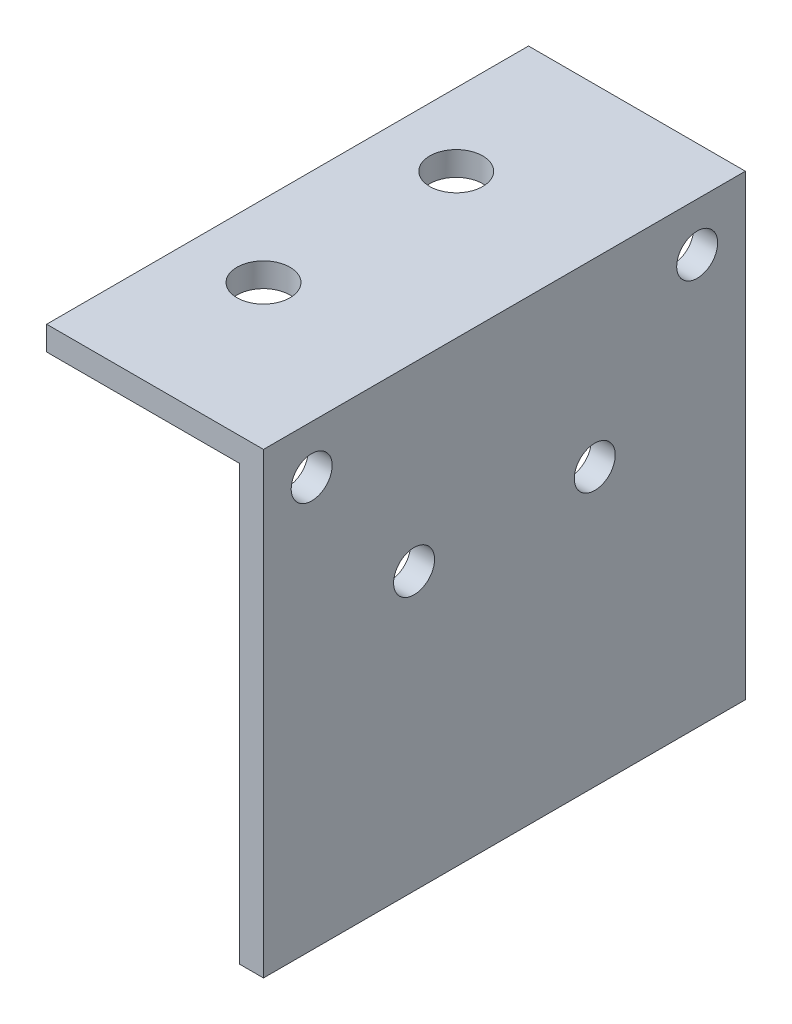
ISO-10303-21;
HEADER;
FILE_DESCRIPTION(('STEP AP214'),'2;1');
FILE_NAME('part.step','',(''),(''),'','','');
FILE_SCHEMA(('AUTOMOTIVE_DESIGN { 1 0 10303 214 1 1 1 1 }'));
ENDSEC;
DATA;
#1=APPLICATION_CONTEXT('core data for automotive mechanical design processes');
#2=APPLICATION_PROTOCOL_DEFINITION('international standard','automotive_design',2000,#1);
#3=PRODUCT_CONTEXT('',#1,'mechanical');
#4=PRODUCT('Part','Part','',(#3));
#5=PRODUCT_RELATED_PRODUCT_CATEGORY('part','',(#4));
#6=PRODUCT_DEFINITION_FORMATION('','',#4);
#7=PRODUCT_DEFINITION_CONTEXT('part definition',#1,'design');
#8=PRODUCT_DEFINITION('design','',#6,#7);
#9=PRODUCT_DEFINITION_SHAPE('','',#8);
#10=(LENGTH_UNIT() NAMED_UNIT(*) SI_UNIT(.MILLI.,.METRE.));
#11=(NAMED_UNIT(*) PLANE_ANGLE_UNIT() SI_UNIT($,.RADIAN.));
#12=(NAMED_UNIT(*) SI_UNIT($,.STERADIAN.) SOLID_ANGLE_UNIT());
#13=UNCERTAINTY_MEASURE_WITH_UNIT(LENGTH_MEASURE(1.E-05),#10,'distance_accuracy_value','');
#14=(GEOMETRIC_REPRESENTATION_CONTEXT(3) GLOBAL_UNCERTAINTY_ASSIGNED_CONTEXT((#13)) GLOBAL_UNIT_ASSIGNED_CONTEXT((#10,
#11,#12)) REPRESENTATION_CONTEXT('',''));
#15=CARTESIAN_POINT('',(0.,0.,0.));
#16=DIRECTION('',(0.,0.,1.));
#17=DIRECTION('',(1.,0.,0.));
#18=AXIS2_PLACEMENT_3D('',#15,#16,#17);
#19=CARTESIAN_POINT('',(0.,-2.,40.));
#20=DIRECTION('',(1.,0.,0.));
#21=DIRECTION('',(0.,0.,-1.));
#22=AXIS2_PLACEMENT_3D('',#19,#20,#21);
#23=PLANE('',#22);
#24=DIRECTION('',(0.,-1.,0.));
#25=VECTOR('',#24,1.);
#26=CARTESIAN_POINT('',(0.,-2.,0.));
#27=LINE('',#26,#25);
#28=CARTESIAN_POINT('',(0.,0.,0.));
#29=VERTEX_POINT('',#28);
#30=CARTESIAN_POINT('',(0.,-2.,0.));
#31=VERTEX_POINT('',#30);
#32=EDGE_CURVE('E119',#29,#31,#27,.T.);
#33=ORIENTED_EDGE('',*,*,#32,.T.);
#34=DIRECTION('',(0.,0.,-1.));
#35=VECTOR('',#34,1.);
#36=CARTESIAN_POINT('',(0.,-2.,40.));
#37=LINE('',#36,#35);
#38=CARTESIAN_POINT('',(0.,-2.,40.));
#39=VERTEX_POINT('',#38);
#40=EDGE_CURVE('E11',#39,#31,#37,.T.);
#41=ORIENTED_EDGE('',*,*,#40,.F.);
#42=DIRECTION('',(0.,-1.,0.));
#43=VECTOR('',#42,1.);
#44=CARTESIAN_POINT('',(0.,-2.,40.));
#45=LINE('',#44,#43);
#46=CARTESIAN_POINT('',(0.,0.,40.));
#47=VERTEX_POINT('',#46);
#48=EDGE_CURVE('E130',#47,#39,#45,.T.);
#49=ORIENTED_EDGE('',*,*,#48,.F.);
#50=DIRECTION('',(0.,0.,-1.));
#51=VECTOR('',#50,1.);
#52=CARTESIAN_POINT('',(0.,0.,40.));
#53=LINE('',#52,#51);
#54=EDGE_CURVE('E115',#47,#29,#53,.T.);
#55=ORIENTED_EDGE('',*,*,#54,.T.);
#56=EDGE_LOOP('',(#33,#41,#49,#55));
#57=FACE_BOUND('',#56,.T.);
#58=ADVANCED_FACE('F35',(#57),#23,.F.);
#59=CARTESIAN_POINT('',(16.,-2.,40.));
#60=DIRECTION('',(0.,1.,0.));
#61=DIRECTION('',(-1.,0.,0.));
#62=AXIS2_PLACEMENT_3D('',#59,#60,#61);
#63=PLANE('',#62);
#64=CARTESIAN_POINT('',(6.,-1.99999999999999,12.));
#65=DIRECTION('',(0.,1.,0.));
#66=DIRECTION('',(-1.,0.,0.));
#67=AXIS2_PLACEMENT_3D('',#64,#65,#66);
#68=CIRCLE('',#67,2.2);
#69=CARTESIAN_POINT('',(3.8,-2.,12.));
#70=VERTEX_POINT('',#69);
#71=EDGE_CURVE('E284',#70,#70,#68,.F.);
#72=ORIENTED_EDGE('',*,*,#71,.F.);
#73=EDGE_LOOP('',(#72));
#74=FACE_BOUND('',#73,.T.);
#75=CARTESIAN_POINT('',(6.,-1.99999999999999,28.));
#76=DIRECTION('',(0.,1.,0.));
#77=DIRECTION('',(-1.,0.,0.));
#78=AXIS2_PLACEMENT_3D('',#75,#76,#77);
#79=CIRCLE('',#78,2.2);
#80=CARTESIAN_POINT('',(3.8,-2.,28.));
#81=VERTEX_POINT('',#80);
#82=EDGE_CURVE('E123',#81,#81,#79,.F.);
#83=ORIENTED_EDGE('',*,*,#82,.F.);
#84=EDGE_LOOP('',(#83));
#85=FACE_BOUND('',#84,.T.);
#86=DIRECTION('',(1.,0.,0.));
#87=VECTOR('',#86,1.);
#88=CARTESIAN_POINT('',(16.,-2.,0.));
#89=LINE('',#88,#87);
#90=CARTESIAN_POINT('',(16.,-2.,0.));
#91=VERTEX_POINT('',#90);
#92=EDGE_CURVE('E122',#31,#91,#89,.T.);
#93=ORIENTED_EDGE('',*,*,#92,.T.);
#94=DIRECTION('',(0.,0.,-1.));
#95=VECTOR('',#94,1.);
#96=CARTESIAN_POINT('',(16.,-2.,40.));
#97=LINE('',#96,#95);
#98=CARTESIAN_POINT('',(16.,-2.,40.));
#99=VERTEX_POINT('',#98);
#100=EDGE_CURVE('E43',#99,#91,#97,.T.);
#101=ORIENTED_EDGE('',*,*,#100,.F.);
#102=DIRECTION('',(1.,0.,0.));
#103=VECTOR('',#102,1.);
#104=CARTESIAN_POINT('',(16.,-2.,40.));
#105=LINE('',#104,#103);
#106=EDGE_CURVE('E88',#39,#99,#105,.T.);
#107=ORIENTED_EDGE('',*,*,#106,.F.);
#108=ORIENTED_EDGE('',*,*,#40,.T.);
#109=EDGE_LOOP('',(#93,#101,#107,#108));
#110=FACE_BOUND('',#109,.T.);
#111=ADVANCED_FACE('F158',(#74,#85,#110),#63,.F.);
#112=CARTESIAN_POINT('',(16.,-38.,40.));
#113=DIRECTION('',(1.,0.,0.));
#114=DIRECTION('',(0.,0.,-1.));
#115=AXIS2_PLACEMENT_3D('',#112,#113,#114);
#116=PLANE('',#115);
#117=CARTESIAN_POINT('',(16.,-4.,4.));
#118=DIRECTION('',(1.,0.,0.));
#119=DIRECTION('',(0.,0.,-1.));
#120=AXIS2_PLACEMENT_3D('',#117,#118,#119);
#121=CIRCLE('',#120,1.7);
#122=CARTESIAN_POINT('',(16.,-4.,2.3));
#123=VERTEX_POINT('',#122);
#124=EDGE_CURVE('E312',#123,#123,#121,.F.);
#125=ORIENTED_EDGE('',*,*,#124,.F.);
#126=EDGE_LOOP('',(#125));
#127=FACE_BOUND('',#126,.T.);
#128=CARTESIAN_POINT('',(16.,-4.,36.));
#129=DIRECTION('',(1.,0.,0.));
#130=DIRECTION('',(0.,0.,-1.));
#131=AXIS2_PLACEMENT_3D('',#128,#129,#130);
#132=CIRCLE('',#131,1.7);
#133=CARTESIAN_POINT('',(16.,-4.,34.3));
#134=VERTEX_POINT('',#133);
#135=EDGE_CURVE('E306',#134,#134,#132,.F.);
#136=ORIENTED_EDGE('',*,*,#135,.F.);
#137=EDGE_LOOP('',(#136));
#138=FACE_BOUND('',#137,.T.);
#139=CARTESIAN_POINT('',(16.,-15.,12.5));
#140=DIRECTION('',(1.,0.,0.));
#141=DIRECTION('',(0.,0.,-1.));
#142=AXIS2_PLACEMENT_3D('',#139,#140,#141);
#143=CIRCLE('',#142,1.7);
#144=CARTESIAN_POINT('',(16.,-15.,10.8));
#145=VERTEX_POINT('',#144);
#146=EDGE_CURVE('E300',#145,#145,#143,.F.);
#147=ORIENTED_EDGE('',*,*,#146,.F.);
#148=EDGE_LOOP('',(#147));
#149=FACE_BOUND('',#148,.T.);
#150=CARTESIAN_POINT('',(16.,-15.,27.5));
#151=DIRECTION('',(1.,0.,0.));
#152=DIRECTION('',(0.,0.,-1.));
#153=AXIS2_PLACEMENT_3D('',#150,#151,#152);
#154=CIRCLE('',#153,1.7);
#155=CARTESIAN_POINT('',(16.,-15.,25.8));
#156=VERTEX_POINT('',#155);
#157=EDGE_CURVE('E294',#156,#156,#154,.F.);
#158=ORIENTED_EDGE('',*,*,#157,.F.);
#159=EDGE_LOOP('',(#158));
#160=FACE_BOUND('',#159,.T.);
#161=DIRECTION('',(0.,-1.,0.));
#162=VECTOR('',#161,1.);
#163=CARTESIAN_POINT('',(16.,-38.,0.));
#164=LINE('',#163,#162);
#165=CARTESIAN_POINT('',(16.,-38.,0.));
#166=VERTEX_POINT('',#165);
#167=EDGE_CURVE('E125',#91,#166,#164,.T.);
#168=ORIENTED_EDGE('',*,*,#167,.T.);
#169=DIRECTION('',(0.,0.,-1.));
#170=VECTOR('',#169,1.);
#171=CARTESIAN_POINT('',(16.,-38.,40.));
#172=LINE('',#171,#170);
#173=CARTESIAN_POINT('',(16.,-38.,40.));
#174=VERTEX_POINT('',#173);
#175=EDGE_CURVE('E110',#174,#166,#172,.T.);
#176=ORIENTED_EDGE('',*,*,#175,.F.);
#177=DIRECTION('',(0.,-1.,0.));
#178=VECTOR('',#177,1.);
#179=CARTESIAN_POINT('',(16.,-38.,40.));
#180=LINE('',#179,#178);
#181=EDGE_CURVE('E101',#99,#174,#180,.T.);
#182=ORIENTED_EDGE('',*,*,#181,.F.);
#183=ORIENTED_EDGE('',*,*,#100,.T.);
#184=EDGE_LOOP('',(#168,#176,#182,#183));
#185=FACE_BOUND('',#184,.T.);
#186=ADVANCED_FACE('F136',(#127,#138,#149,#160,#185),#116,.F.);
#187=CARTESIAN_POINT('',(18.,-38.,40.));
#188=DIRECTION('',(0.,1.,0.));
#189=DIRECTION('',(0.,0.,1.));
#190=AXIS2_PLACEMENT_3D('',#187,#188,#189);
#191=PLANE('',#190);
#192=DIRECTION('',(1.,0.,0.));
#193=VECTOR('',#192,1.);
#194=CARTESIAN_POINT('',(18.,-38.,0.));
#195=LINE('',#194,#193);
#196=CARTESIAN_POINT('',(18.,-38.,0.));
#197=VERTEX_POINT('',#196);
#198=EDGE_CURVE('E109',#166,#197,#195,.T.);
#199=ORIENTED_EDGE('',*,*,#198,.T.);
#200=DIRECTION('',(0.,0.,-1.));
#201=VECTOR('',#200,1.);
#202=CARTESIAN_POINT('',(18.,-38.,40.));
#203=LINE('',#202,#201);
#204=CARTESIAN_POINT('',(18.,-38.,40.));
#205=VERTEX_POINT('',#204);
#206=EDGE_CURVE('E106',#205,#197,#203,.T.);
#207=ORIENTED_EDGE('',*,*,#206,.F.);
#208=DIRECTION('',(1.,0.,0.));
#209=VECTOR('',#208,1.);
#210=CARTESIAN_POINT('',(18.,-38.,40.));
#211=LINE('',#210,#209);
#212=EDGE_CURVE('E95',#174,#205,#211,.T.);
#213=ORIENTED_EDGE('',*,*,#212,.F.);
#214=ORIENTED_EDGE('',*,*,#175,.T.);
#215=EDGE_LOOP('',(#199,#207,#213,#214));
#216=FACE_BOUND('',#215,.T.);
#217=ADVANCED_FACE('F107',(#216),#191,.F.);
#218=CARTESIAN_POINT('',(18.,0.,40.));
#219=DIRECTION('',(-1.,0.,0.));
#220=DIRECTION('',(0.,-1.,0.));
#221=AXIS2_PLACEMENT_3D('',#218,#219,#220);
#222=PLANE('',#221);
#223=CARTESIAN_POINT('',(18.,-4.,4.));
#224=DIRECTION('',(1.,0.,0.));
#225=DIRECTION('',(0.,1.,0.));
#226=AXIS2_PLACEMENT_3D('',#223,#224,#225);
#227=CIRCLE('',#226,1.7);
#228=CARTESIAN_POINT('',(18.,-2.3,4.));
#229=VERTEX_POINT('',#228);
#230=EDGE_CURVE('E315',#229,#229,#227,.T.);
#231=ORIENTED_EDGE('',*,*,#230,.F.);
#232=EDGE_LOOP('',(#231));
#233=FACE_BOUND('',#232,.T.);
#234=CARTESIAN_POINT('',(18.,-4.,36.));
#235=DIRECTION('',(1.,0.,0.));
#236=DIRECTION('',(0.,1.,0.));
#237=AXIS2_PLACEMENT_3D('',#234,#235,#236);
#238=CIRCLE('',#237,1.7);
#239=CARTESIAN_POINT('',(18.,-2.3,36.));
#240=VERTEX_POINT('',#239);
#241=EDGE_CURVE('E309',#240,#240,#238,.T.);
#242=ORIENTED_EDGE('',*,*,#241,.F.);
#243=EDGE_LOOP('',(#242));
#244=FACE_BOUND('',#243,.T.);
#245=CARTESIAN_POINT('',(18.,-15.,12.5));
#246=DIRECTION('',(1.,0.,0.));
#247=DIRECTION('',(0.,1.,0.));
#248=AXIS2_PLACEMENT_3D('',#245,#246,#247);
#249=CIRCLE('',#248,1.7);
#250=CARTESIAN_POINT('',(18.,-13.3,12.5));
#251=VERTEX_POINT('',#250);
#252=EDGE_CURVE('E303',#251,#251,#249,.T.);
#253=ORIENTED_EDGE('',*,*,#252,.F.);
#254=EDGE_LOOP('',(#253));
#255=FACE_BOUND('',#254,.T.);
#256=CARTESIAN_POINT('',(18.,-15.,27.5));
#257=DIRECTION('',(1.,0.,0.));
#258=DIRECTION('',(0.,1.,0.));
#259=AXIS2_PLACEMENT_3D('',#256,#257,#258);
#260=CIRCLE('',#259,1.7);
#261=CARTESIAN_POINT('',(18.,-13.3,27.5));
#262=VERTEX_POINT('',#261);
#263=EDGE_CURVE('E297',#262,#262,#260,.T.);
#264=ORIENTED_EDGE('',*,*,#263,.F.);
#265=EDGE_LOOP('',(#264));
#266=FACE_BOUND('',#265,.T.);
#267=DIRECTION('',(0.,1.,0.));
#268=VECTOR('',#267,1.);
#269=CARTESIAN_POINT('',(18.,0.,0.));
#270=LINE('',#269,#268);
#271=CARTESIAN_POINT('',(18.,0.,0.));
#272=VERTEX_POINT('',#271);
#273=EDGE_CURVE('E74',#197,#272,#270,.T.);
#274=ORIENTED_EDGE('',*,*,#273,.T.);
#275=DIRECTION('',(0.,0.,-1.));
#276=VECTOR('',#275,1.);
#277=CARTESIAN_POINT('',(18.,0.,40.));
#278=LINE('',#277,#276);
#279=CARTESIAN_POINT('',(18.,0.,40.));
#280=VERTEX_POINT('',#279);
#281=EDGE_CURVE('E111',#280,#272,#278,.T.);
#282=ORIENTED_EDGE('',*,*,#281,.F.);
#283=DIRECTION('',(0.,1.,0.));
#284=VECTOR('',#283,1.);
#285=CARTESIAN_POINT('',(18.,0.,40.));
#286=LINE('',#285,#284);
#287=EDGE_CURVE('E99',#205,#280,#286,.T.);
#288=ORIENTED_EDGE('',*,*,#287,.F.);
#289=ORIENTED_EDGE('',*,*,#206,.T.);
#290=EDGE_LOOP('',(#274,#282,#288,#289));
#291=FACE_BOUND('',#290,.T.);
#292=ADVANCED_FACE('F113',(#233,#244,#255,#266,#291),#222,.F.);
#293=CARTESIAN_POINT('',(0.,0.,40.));
#294=DIRECTION('',(0.,-1.,0.));
#295=DIRECTION('',(0.,0.,-1.));
#296=AXIS2_PLACEMENT_3D('',#293,#294,#295);
#297=PLANE('',#296);
#298=CARTESIAN_POINT('',(6.,0.,12.));
#299=DIRECTION('',(0.,1.,0.));
#300=DIRECTION('',(0.,0.,1.));
#301=AXIS2_PLACEMENT_3D('',#298,#299,#300);
#302=CIRCLE('',#301,2.2);
#303=CARTESIAN_POINT('',(6.,0.,14.2));
#304=VERTEX_POINT('',#303);
#305=EDGE_CURVE('E291',#304,#304,#302,.T.);
#306=ORIENTED_EDGE('',*,*,#305,.F.);
#307=EDGE_LOOP('',(#306));
#308=FACE_BOUND('',#307,.T.);
#309=CARTESIAN_POINT('',(6.,0.,28.));
#310=DIRECTION('',(0.,1.,0.));
#311=DIRECTION('',(0.,0.,1.));
#312=AXIS2_PLACEMENT_3D('',#309,#310,#311);
#313=CIRCLE('',#312,2.2);
#314=CARTESIAN_POINT('',(6.,0.,30.2));
#315=VERTEX_POINT('',#314);
#316=EDGE_CURVE('E280',#315,#315,#313,.T.);
#317=ORIENTED_EDGE('',*,*,#316,.F.);
#318=EDGE_LOOP('',(#317));
#319=FACE_BOUND('',#318,.T.);
#320=DIRECTION('',(-1.,0.,0.));
#321=VECTOR('',#320,1.);
#322=CARTESIAN_POINT('',(0.,0.,0.));
#323=LINE('',#322,#321);
#324=EDGE_CURVE('E80',#272,#29,#323,.T.);
#325=ORIENTED_EDGE('',*,*,#324,.T.);
#326=ORIENTED_EDGE('',*,*,#54,.F.);
#327=DIRECTION('',(-1.,0.,0.));
#328=VECTOR('',#327,1.);
#329=CARTESIAN_POINT('',(0.,0.,40.));
#330=LINE('',#329,#328);
#331=EDGE_CURVE('E51',#280,#47,#330,.T.);
#332=ORIENTED_EDGE('',*,*,#331,.F.);
#333=ORIENTED_EDGE('',*,*,#281,.T.);
#334=EDGE_LOOP('',(#325,#326,#332,#333));
#335=FACE_BOUND('',#334,.T.);
#336=ADVANCED_FACE('F143',(#308,#319,#335),#297,.F.);
#337=CARTESIAN_POINT('',(0.,0.,40.));
#338=DIRECTION('',(0.,0.,-1.));
#339=DIRECTION('',(-1.,0.,0.));
#340=AXIS2_PLACEMENT_3D('',#337,#338,#339);
#341=PLANE('',#340);
#342=ORIENTED_EDGE('',*,*,#48,.T.);
#343=ORIENTED_EDGE('',*,*,#106,.T.);
#344=ORIENTED_EDGE('',*,*,#181,.T.);
#345=ORIENTED_EDGE('',*,*,#212,.T.);
#346=ORIENTED_EDGE('',*,*,#287,.T.);
#347=ORIENTED_EDGE('',*,*,#331,.T.);
#348=EDGE_LOOP('',(#342,#343,#344,#345,#346,#347));
#349=FACE_BOUND('',#348,.T.);
#350=ADVANCED_FACE('F97',(#349),#341,.F.);
#351=CARTESIAN_POINT('',(0.,0.,0.));
#352=DIRECTION('',(0.,0.,-1.));
#353=DIRECTION('',(-1.,0.,0.));
#354=AXIS2_PLACEMENT_3D('',#351,#352,#353);
#355=PLANE('',#354);
#356=ORIENTED_EDGE('',*,*,#32,.F.);
#357=ORIENTED_EDGE('',*,*,#324,.F.);
#358=ORIENTED_EDGE('',*,*,#273,.F.);
#359=ORIENTED_EDGE('',*,*,#198,.F.);
#360=ORIENTED_EDGE('',*,*,#167,.F.);
#361=ORIENTED_EDGE('',*,*,#92,.F.);
#362=EDGE_LOOP('',(#356,#357,#358,#359,#360,#361));
#363=FACE_BOUND('',#362,.T.);
#364=ADVANCED_FACE('F139',(#363),#355,.T.);
#365=CARTESIAN_POINT('',(6.,-38.001,28.));
#366=DIRECTION('',(0.,1.,0.));
#367=DIRECTION('',(0.,0.,1.));
#368=AXIS2_PLACEMENT_3D('',#365,#366,#367);
#369=CYLINDRICAL_SURFACE('',#368,2.2);
#370=ORIENTED_EDGE('',*,*,#316,.T.);
#371=EDGE_LOOP('',(#370));
#372=FACE_BOUND('',#371,.T.);
#373=ORIENTED_EDGE('',*,*,#82,.T.);
#374=EDGE_LOOP('',(#373));
#375=FACE_BOUND('',#374,.T.);
#376=ADVANCED_FACE('F236',(#372,#375),#369,.F.);
#377=CARTESIAN_POINT('',(6.,-38.001,12.));
#378=DIRECTION('',(0.,1.,0.));
#379=DIRECTION('',(0.,0.,1.));
#380=AXIS2_PLACEMENT_3D('',#377,#378,#379);
#381=CYLINDRICAL_SURFACE('',#380,2.2);
#382=ORIENTED_EDGE('',*,*,#305,.T.);
#383=EDGE_LOOP('',(#382));
#384=FACE_BOUND('',#383,.T.);
#385=ORIENTED_EDGE('',*,*,#71,.T.);
#386=EDGE_LOOP('',(#385));
#387=FACE_BOUND('',#386,.T.);
#388=ADVANCED_FACE('F196',(#384,#387),#381,.F.);
#389=CARTESIAN_POINT('',(-0.00100000000000447,-15.,27.5));
#390=DIRECTION('',(1.,0.,0.));
#391=DIRECTION('',(0.,1.,0.));
#392=AXIS2_PLACEMENT_3D('',#389,#390,#391);
#393=CYLINDRICAL_SURFACE('',#392,1.7);
#394=ORIENTED_EDGE('',*,*,#263,.T.);
#395=EDGE_LOOP('',(#394));
#396=FACE_BOUND('',#395,.T.);
#397=ORIENTED_EDGE('',*,*,#157,.T.);
#398=EDGE_LOOP('',(#397));
#399=FACE_BOUND('',#398,.T.);
#400=ADVANCED_FACE('F190',(#396,#399),#393,.F.);
#401=CARTESIAN_POINT('',(-0.00100000000000447,-15.,12.5));
#402=DIRECTION('',(1.,0.,0.));
#403=DIRECTION('',(0.,1.,0.));
#404=AXIS2_PLACEMENT_3D('',#401,#402,#403);
#405=CYLINDRICAL_SURFACE('',#404,1.7);
#406=ORIENTED_EDGE('',*,*,#252,.T.);
#407=EDGE_LOOP('',(#406));
#408=FACE_BOUND('',#407,.T.);
#409=ORIENTED_EDGE('',*,*,#146,.T.);
#410=EDGE_LOOP('',(#409));
#411=FACE_BOUND('',#410,.T.);
#412=ADVANCED_FACE('F195',(#408,#411),#405,.F.);
#413=CARTESIAN_POINT('',(-0.00100000000000447,-4.,36.));
#414=DIRECTION('',(1.,0.,0.));
#415=DIRECTION('',(0.,1.,0.));
#416=AXIS2_PLACEMENT_3D('',#413,#414,#415);
#417=CYLINDRICAL_SURFACE('',#416,1.7);
#418=ORIENTED_EDGE('',*,*,#241,.T.);
#419=EDGE_LOOP('',(#418));
#420=FACE_BOUND('',#419,.T.);
#421=ORIENTED_EDGE('',*,*,#135,.T.);
#422=EDGE_LOOP('',(#421));
#423=FACE_BOUND('',#422,.T.);
#424=ADVANCED_FACE('F208',(#420,#423),#417,.F.);
#425=CARTESIAN_POINT('',(-0.00100000000000447,-4.,4.));
#426=DIRECTION('',(1.,0.,0.));
#427=DIRECTION('',(0.,1.,0.));
#428=AXIS2_PLACEMENT_3D('',#425,#426,#427);
#429=CYLINDRICAL_SURFACE('',#428,1.7);
#430=ORIENTED_EDGE('',*,*,#230,.T.);
#431=EDGE_LOOP('',(#430));
#432=FACE_BOUND('',#431,.T.);
#433=ORIENTED_EDGE('',*,*,#124,.T.);
#434=EDGE_LOOP('',(#433));
#435=FACE_BOUND('',#434,.T.);
#436=ADVANCED_FACE('F218',(#432,#435),#429,.F.);
#437=CLOSED_SHELL('',(#58,#111,#186,#217,#292,#336,#350,#364,#376,#388,#400,#412,#424,#436));
#438=MANIFOLD_SOLID_BREP('B2',#437);
#439=ADVANCED_BREP_SHAPE_REPRESENTATION('',(#18,#438),#14);
#440=SHAPE_DEFINITION_REPRESENTATION(#9,#439);
ENDSEC;
END-ISO-10303-21;
